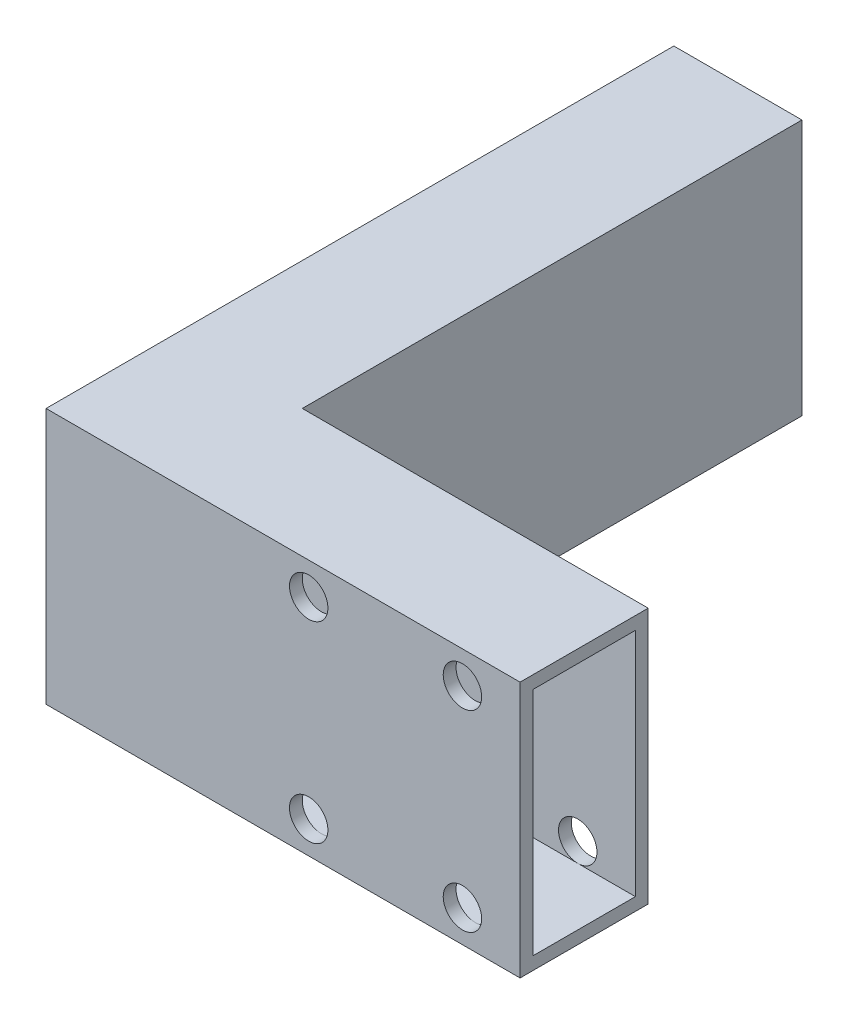
ISO-10303-21;
HEADER;
FILE_DESCRIPTION(('STEP AP214'),'2;1');
FILE_NAME('part.step','',(''),(''),'','','');
FILE_SCHEMA(('AUTOMOTIVE_DESIGN { 1 0 10303 214 1 1 1 1 }'));
ENDSEC;
DATA;
#1=APPLICATION_CONTEXT('core data for automotive mechanical design processes');
#2=APPLICATION_PROTOCOL_DEFINITION('international standard','automotive_design',2000,#1);
#3=PRODUCT_CONTEXT('',#1,'mechanical');
#4=PRODUCT('Part','Part','',(#3));
#5=PRODUCT_RELATED_PRODUCT_CATEGORY('part','',(#4));
#6=PRODUCT_DEFINITION_FORMATION('','',#4);
#7=PRODUCT_DEFINITION_CONTEXT('part definition',#1,'design');
#8=PRODUCT_DEFINITION('design','',#6,#7);
#9=PRODUCT_DEFINITION_SHAPE('','',#8);
#10=(LENGTH_UNIT() NAMED_UNIT(*) SI_UNIT(.MILLI.,.METRE.));
#11=(NAMED_UNIT(*) PLANE_ANGLE_UNIT() SI_UNIT($,.RADIAN.));
#12=(NAMED_UNIT(*) SI_UNIT($,.STERADIAN.) SOLID_ANGLE_UNIT());
#13=UNCERTAINTY_MEASURE_WITH_UNIT(LENGTH_MEASURE(1.E-05),#10,'distance_accuracy_value','');
#14=(GEOMETRIC_REPRESENTATION_CONTEXT(3) GLOBAL_UNCERTAINTY_ASSIGNED_CONTEXT((#13)) GLOBAL_UNIT_ASSIGNED_CONTEXT((#10,
#11,#12)) REPRESENTATION_CONTEXT('',''));
#15=CARTESIAN_POINT('',(0.,0.,0.));
#16=DIRECTION('',(0.,0.,1.));
#17=DIRECTION('',(1.,0.,0.));
#18=AXIS2_PLACEMENT_3D('',#15,#16,#17);
#19=CARTESIAN_POINT('',(20.5,17.5,-10.));
#20=DIRECTION('',(0.,0.,-1.));
#21=DIRECTION('',(-1.,0.,0.));
#22=AXIS2_PLACEMENT_3D('',#19,#20,#21);
#23=CYLINDRICAL_SURFACE('',#22,1.5);
#24=CARTESIAN_POINT('',(20.5,17.5,-0.999999999999999));
#25=DIRECTION('',(0.,0.,1.));
#26=DIRECTION('',(1.,0.,0.));
#27=AXIS2_PLACEMENT_3D('',#24,#25,#26);
#28=CIRCLE('',#27,1.5);
#29=CARTESIAN_POINT('',(20.5,19.,-0.999999999999999));
#30=VERTEX_POINT('',#29);
#31=EDGE_CURVE('E237',#30,#30,#28,.F.);
#32=ORIENTED_EDGE('',*,*,#31,.T.);
#33=EDGE_LOOP('',(#32));
#34=FACE_BOUND('',#33,.T.);
#35=CARTESIAN_POINT('',(20.5,17.5,0.));
#36=DIRECTION('',(0.,0.,-1.));
#37=DIRECTION('',(-1.,0.,0.));
#38=AXIS2_PLACEMENT_3D('',#35,#36,#37);
#39=CIRCLE('',#38,1.5);
#40=CARTESIAN_POINT('',(19.,17.5,0.));
#41=VERTEX_POINT('',#40);
#42=EDGE_CURVE('E271',#41,#41,#39,.T.);
#43=ORIENTED_EDGE('',*,*,#42,.F.);
#44=EDGE_LOOP('',(#43));
#45=FACE_BOUND('',#44,.T.);
#46=ADVANCED_FACE('F35',(#34,#45),#23,.F.);
#47=CARTESIAN_POINT('',(32.5,17.5,-10.));
#48=DIRECTION('',(0.,0.,-1.));
#49=DIRECTION('',(-1.,0.,0.));
#50=AXIS2_PLACEMENT_3D('',#47,#48,#49);
#51=CYLINDRICAL_SURFACE('',#50,1.5);
#52=CARTESIAN_POINT('',(32.5,17.5,-0.999999999999999));
#53=DIRECTION('',(0.,0.,1.));
#54=DIRECTION('',(1.,0.,0.));
#55=AXIS2_PLACEMENT_3D('',#52,#53,#54);
#56=CIRCLE('',#55,1.5);
#57=CARTESIAN_POINT('',(32.5,19.,-0.999999999999999));
#58=VERTEX_POINT('',#57);
#59=EDGE_CURVE('E234',#58,#58,#56,.F.);
#60=ORIENTED_EDGE('',*,*,#59,.T.);
#61=EDGE_LOOP('',(#60));
#62=FACE_BOUND('',#61,.T.);
#63=CARTESIAN_POINT('',(32.5,17.5,0.));
#64=DIRECTION('',(0.,0.,-1.));
#65=DIRECTION('',(-1.,0.,0.));
#66=AXIS2_PLACEMENT_3D('',#63,#64,#65);
#67=CIRCLE('',#66,1.5);
#68=CARTESIAN_POINT('',(31.,17.5,0.));
#69=VERTEX_POINT('',#68);
#70=EDGE_CURVE('E265',#69,#69,#67,.T.);
#71=ORIENTED_EDGE('',*,*,#70,.F.);
#72=EDGE_LOOP('',(#71));
#73=FACE_BOUND('',#72,.T.);
#74=ADVANCED_FACE('F340',(#62,#73),#51,.F.);
#75=CARTESIAN_POINT('',(32.5,2.5,-10.));
#76=DIRECTION('',(0.,0.,-1.));
#77=DIRECTION('',(-1.,0.,0.));
#78=AXIS2_PLACEMENT_3D('',#75,#76,#77);
#79=CYLINDRICAL_SURFACE('',#78,1.5);
#80=CARTESIAN_POINT('',(32.5,2.5,-0.999999999999999));
#81=DIRECTION('',(0.,0.,1.));
#82=DIRECTION('',(1.,0.,0.));
#83=AXIS2_PLACEMENT_3D('',#80,#81,#82);
#84=CIRCLE('',#83,1.5);
#85=CARTESIAN_POINT('',(32.5,0.999999999999999,-0.999999999999999));
#86=VERTEX_POINT('',#85);
#87=EDGE_CURVE('E231',#86,#86,#84,.F.);
#88=ORIENTED_EDGE('',*,*,#87,.T.);
#89=EDGE_LOOP('',(#88));
#90=FACE_BOUND('',#89,.T.);
#91=CARTESIAN_POINT('',(32.5,2.5,0.));
#92=DIRECTION('',(0.,0.,-1.));
#93=DIRECTION('',(-1.,0.,0.));
#94=AXIS2_PLACEMENT_3D('',#91,#92,#93);
#95=CIRCLE('',#94,1.5);
#96=CARTESIAN_POINT('',(31.,2.5,0.));
#97=VERTEX_POINT('',#96);
#98=EDGE_CURVE('E259',#97,#97,#95,.T.);
#99=ORIENTED_EDGE('',*,*,#98,.F.);
#100=EDGE_LOOP('',(#99));
#101=FACE_BOUND('',#100,.T.);
#102=ADVANCED_FACE('F347',(#90,#101),#79,.F.);
#103=CARTESIAN_POINT('',(20.5,2.5,-10.));
#104=DIRECTION('',(0.,0.,-1.));
#105=DIRECTION('',(-1.,0.,0.));
#106=AXIS2_PLACEMENT_3D('',#103,#104,#105);
#107=CYLINDRICAL_SURFACE('',#106,1.5);
#108=CARTESIAN_POINT('',(20.5,2.5,-0.999999999999999));
#109=DIRECTION('',(0.,0.,1.));
#110=DIRECTION('',(1.,0.,0.));
#111=AXIS2_PLACEMENT_3D('',#108,#109,#110);
#112=CIRCLE('',#111,1.5);
#113=CARTESIAN_POINT('',(20.5,1.,-0.999999999999999));
#114=VERTEX_POINT('',#113);
#115=EDGE_CURVE('E228',#114,#114,#112,.F.);
#116=ORIENTED_EDGE('',*,*,#115,.T.);
#117=EDGE_LOOP('',(#116));
#118=FACE_BOUND('',#117,.T.);
#119=CARTESIAN_POINT('',(20.5,2.5,0.));
#120=DIRECTION('',(0.,0.,-1.));
#121=DIRECTION('',(-1.,0.,0.));
#122=AXIS2_PLACEMENT_3D('',#119,#120,#121);
#123=CIRCLE('',#122,1.5);
#124=CARTESIAN_POINT('',(19.,2.5,0.));
#125=VERTEX_POINT('',#124);
#126=EDGE_CURVE('E253',#125,#125,#123,.T.);
#127=ORIENTED_EDGE('',*,*,#126,.F.);
#128=EDGE_LOOP('',(#127));
#129=FACE_BOUND('',#128,.T.);
#130=ADVANCED_FACE('F388',(#118,#129),#107,.F.);
#131=CARTESIAN_POINT('',(37.,20.,0.));
#132=DIRECTION('',(0.,0.,-1.));
#133=DIRECTION('',(-1.,0.,0.));
#134=AXIS2_PLACEMENT_3D('',#131,#132,#133);
#135=PLANE('',#134);
#136=ORIENTED_EDGE('',*,*,#126,.T.);
#137=EDGE_LOOP('',(#136));
#138=FACE_BOUND('',#137,.T.);
#139=ORIENTED_EDGE('',*,*,#98,.T.);
#140=EDGE_LOOP('',(#139));
#141=FACE_BOUND('',#140,.T.);
#142=ORIENTED_EDGE('',*,*,#70,.T.);
#143=EDGE_LOOP('',(#142));
#144=FACE_BOUND('',#143,.T.);
#145=ORIENTED_EDGE('',*,*,#42,.T.);
#146=EDGE_LOOP('',(#145));
#147=FACE_BOUND('',#146,.T.);
#148=DIRECTION('',(1.,0.,0.));
#149=VECTOR('',#148,1.);
#150=CARTESIAN_POINT('',(37.,0.,0.));
#151=LINE('',#150,#149);
#152=CARTESIAN_POINT('',(0.,0.,0.));
#153=VERTEX_POINT('',#152);
#154=CARTESIAN_POINT('',(37.,0.,0.));
#155=VERTEX_POINT('',#154);
#156=EDGE_CURVE('E274',#153,#155,#151,.T.);
#157=ORIENTED_EDGE('',*,*,#156,.T.);
#158=DIRECTION('',(0.,-1.,0.));
#159=VECTOR('',#158,1.);
#160=CARTESIAN_POINT('',(37.,20.,0.));
#161=LINE('',#160,#159);
#162=CARTESIAN_POINT('',(37.,20.,0.));
#163=VERTEX_POINT('',#162);
#164=EDGE_CURVE('E11',#163,#155,#161,.T.);
#165=ORIENTED_EDGE('',*,*,#164,.F.);
#166=DIRECTION('',(1.,0.,0.));
#167=VECTOR('',#166,1.);
#168=CARTESIAN_POINT('',(37.,20.,0.));
#169=LINE('',#168,#167);
#170=CARTESIAN_POINT('',(0.,20.,0.));
#171=VERTEX_POINT('',#170);
#172=EDGE_CURVE('E275',#171,#163,#169,.T.);
#173=ORIENTED_EDGE('',*,*,#172,.F.);
#174=DIRECTION('',(0.,-1.,0.));
#175=VECTOR('',#174,1.);
#176=CARTESIAN_POINT('',(0.,20.,0.));
#177=LINE('',#176,#175);
#178=EDGE_CURVE('E287',#171,#153,#177,.T.);
#179=ORIENTED_EDGE('',*,*,#178,.T.);
#180=EDGE_LOOP('',(#157,#165,#173,#179));
#181=FACE_BOUND('',#180,.T.);
#182=ADVANCED_FACE('F37',(#138,#141,#144,#147,#181),#135,.F.);
#183=CARTESIAN_POINT('',(37.,20.,-10.));
#184=DIRECTION('',(-1.,0.,0.));
#185=DIRECTION('',(0.,0.,1.));
#186=AXIS2_PLACEMENT_3D('',#183,#184,#185);
#187=PLANE('',#186);
#188=DIRECTION('',(0.,1.,0.));
#189=VECTOR('',#188,1.);
#190=CARTESIAN_POINT('',(37.,1.,-9.));
#191=LINE('',#190,#189);
#192=CARTESIAN_POINT('',(37.,1.,-9.));
#193=VERTEX_POINT('',#192);
#194=CARTESIAN_POINT('',(37.,19.,-9.));
#195=VERTEX_POINT('',#194);
#196=EDGE_CURVE('E190',#193,#195,#191,.T.);
#197=ORIENTED_EDGE('',*,*,#196,.F.);
#198=DIRECTION('',(0.,0.,-1.));
#199=VECTOR('',#198,1.);
#200=CARTESIAN_POINT('',(37.,1.,-0.999999999999999));
#201=LINE('',#200,#199);
#202=CARTESIAN_POINT('',(37.,1.,-0.999999999999999));
#203=VERTEX_POINT('',#202);
#204=EDGE_CURVE('E50',#203,#193,#201,.T.);
#205=ORIENTED_EDGE('',*,*,#204,.F.);
#206=DIRECTION('',(0.,-1.,0.));
#207=VECTOR('',#206,1.);
#208=CARTESIAN_POINT('',(37.,19.,-0.999999999999999));
#209=LINE('',#208,#207);
#210=CARTESIAN_POINT('',(37.,19.,-0.999999999999999));
#211=VERTEX_POINT('',#210);
#212=EDGE_CURVE('E196',#211,#203,#209,.T.);
#213=ORIENTED_EDGE('',*,*,#212,.F.);
#214=DIRECTION('',(0.,0.,1.));
#215=VECTOR('',#214,1.);
#216=CARTESIAN_POINT('',(37.,19.,-9.));
#217=LINE('',#216,#215);
#218=EDGE_CURVE('E193',#195,#211,#217,.T.);
#219=ORIENTED_EDGE('',*,*,#218,.F.);
#220=EDGE_LOOP('',(#197,#205,#213,#219));
#221=FACE_BOUND('',#220,.T.);
#222=DIRECTION('',(0.,0.,-1.));
#223=VECTOR('',#222,1.);
#224=CARTESIAN_POINT('',(37.,0.,-10.));
#225=LINE('',#224,#223);
#226=CARTESIAN_POINT('',(37.,0.,-10.));
#227=VERTEX_POINT('',#226);
#228=EDGE_CURVE('E290',#155,#227,#225,.T.);
#229=ORIENTED_EDGE('',*,*,#228,.T.);
#230=DIRECTION('',(0.,-1.,0.));
#231=VECTOR('',#230,1.);
#232=CARTESIAN_POINT('',(37.,20.,-10.));
#233=LINE('',#232,#231);
#234=CARTESIAN_POINT('',(37.,20.,-10.));
#235=VERTEX_POINT('',#234);
#236=EDGE_CURVE('E43',#235,#227,#233,.T.);
#237=ORIENTED_EDGE('',*,*,#236,.F.);
#238=DIRECTION('',(0.,0.,-1.));
#239=VECTOR('',#238,1.);
#240=CARTESIAN_POINT('',(37.,20.,-10.));
#241=LINE('',#240,#239);
#242=EDGE_CURVE('E278',#163,#235,#241,.T.);
#243=ORIENTED_EDGE('',*,*,#242,.F.);
#244=ORIENTED_EDGE('',*,*,#164,.T.);
#245=EDGE_LOOP('',(#229,#237,#243,#244));
#246=FACE_BOUND('',#245,.T.);
#247=ADVANCED_FACE('F326',(#221,#246),#187,.F.);
#248=CARTESIAN_POINT('',(10.,20.,-10.));
#249=DIRECTION('',(0.,0.,1.));
#250=DIRECTION('',(1.,0.,0.));
#251=AXIS2_PLACEMENT_3D('',#248,#249,#250);
#252=PLANE('',#251);
#253=CARTESIAN_POINT('',(20.5,2.5,-10.));
#254=DIRECTION('',(0.,0.,-1.));
#255=DIRECTION('',(-1.,0.,0.));
#256=AXIS2_PLACEMENT_3D('',#253,#254,#255);
#257=CIRCLE('',#256,1.5);
#258=CARTESIAN_POINT('',(19.,2.5,-10.));
#259=VERTEX_POINT('',#258);
#260=EDGE_CURVE('E247',#259,#259,#257,.T.);
#261=ORIENTED_EDGE('',*,*,#260,.F.);
#262=EDGE_LOOP('',(#261));
#263=FACE_BOUND('',#262,.T.);
#264=CARTESIAN_POINT('',(32.5,2.5,-10.));
#265=DIRECTION('',(0.,0.,-1.));
#266=DIRECTION('',(-1.,0.,0.));
#267=AXIS2_PLACEMENT_3D('',#264,#265,#266);
#268=CIRCLE('',#267,1.5);
#269=CARTESIAN_POINT('',(31.,2.5,-10.));
#270=VERTEX_POINT('',#269);
#271=EDGE_CURVE('E256',#270,#270,#268,.T.);
#272=ORIENTED_EDGE('',*,*,#271,.F.);
#273=EDGE_LOOP('',(#272));
#274=FACE_BOUND('',#273,.T.);
#275=CARTESIAN_POINT('',(32.5,17.5,-10.));
#276=DIRECTION('',(0.,0.,-1.));
#277=DIRECTION('',(-1.,0.,0.));
#278=AXIS2_PLACEMENT_3D('',#275,#276,#277);
#279=CIRCLE('',#278,1.5);
#280=CARTESIAN_POINT('',(31.,17.5,-10.));
#281=VERTEX_POINT('',#280);
#282=EDGE_CURVE('E262',#281,#281,#279,.T.);
#283=ORIENTED_EDGE('',*,*,#282,.F.);
#284=EDGE_LOOP('',(#283));
#285=FACE_BOUND('',#284,.T.);
#286=CARTESIAN_POINT('',(20.5,17.5,-10.));
#287=DIRECTION('',(0.,0.,-1.));
#288=DIRECTION('',(-1.,0.,0.));
#289=AXIS2_PLACEMENT_3D('',#286,#287,#288);
#290=CIRCLE('',#289,1.5);
#291=CARTESIAN_POINT('',(19.,17.5,-10.));
#292=VERTEX_POINT('',#291);
#293=EDGE_CURVE('E268',#292,#292,#290,.T.);
#294=ORIENTED_EDGE('',*,*,#293,.F.);
#295=EDGE_LOOP('',(#294));
#296=FACE_BOUND('',#295,.T.);
#297=DIRECTION('',(-1.,0.,0.));
#298=VECTOR('',#297,1.);
#299=CARTESIAN_POINT('',(10.,0.,-10.));
#300=LINE('',#299,#298);
#301=CARTESIAN_POINT('',(10.,0.,-10.));
#302=VERTEX_POINT('',#301);
#303=EDGE_CURVE('E292',#227,#302,#300,.T.);
#304=ORIENTED_EDGE('',*,*,#303,.T.);
#305=DIRECTION('',(0.,-1.,0.));
#306=VECTOR('',#305,1.);
#307=CARTESIAN_POINT('',(10.,20.,-10.));
#308=LINE('',#307,#306);
#309=CARTESIAN_POINT('',(10.,20.,-10.));
#310=VERTEX_POINT('',#309);
#311=EDGE_CURVE('E299',#310,#302,#308,.T.);
#312=ORIENTED_EDGE('',*,*,#311,.F.);
#313=DIRECTION('',(-1.,0.,0.));
#314=VECTOR('',#313,1.);
#315=CARTESIAN_POINT('',(10.,20.,-10.));
#316=LINE('',#315,#314);
#317=EDGE_CURVE('E281',#235,#310,#316,.T.);
#318=ORIENTED_EDGE('',*,*,#317,.F.);
#319=ORIENTED_EDGE('',*,*,#236,.T.);
#320=EDGE_LOOP('',(#304,#312,#318,#319));
#321=FACE_BOUND('',#320,.T.);
#322=ADVANCED_FACE('F306',(#263,#274,#285,#296,#321),#252,.F.);
#323=CARTESIAN_POINT('',(10.,20.,-35.));
#324=DIRECTION('',(-1.,0.,0.));
#325=DIRECTION('',(0.,0.,1.));
#326=AXIS2_PLACEMENT_3D('',#323,#324,#325);
#327=PLANE('',#326);
#328=DIRECTION('',(0.,0.,-1.));
#329=VECTOR('',#328,1.);
#330=CARTESIAN_POINT('',(10.,0.,-35.));
#331=LINE('',#330,#329);
#332=CARTESIAN_POINT('',(10.,0.,-49.));
#333=VERTEX_POINT('',#332);
#334=EDGE_CURVE('E294',#302,#333,#331,.T.);
#335=ORIENTED_EDGE('',*,*,#334,.T.);
#336=DIRECTION('',(0.,-1.,0.));
#337=VECTOR('',#336,1.);
#338=CARTESIAN_POINT('',(10.,0.,-49.));
#339=LINE('',#338,#337);
#340=CARTESIAN_POINT('',(10.,20.,-49.));
#341=VERTEX_POINT('',#340);
#342=EDGE_CURVE('E183',#341,#333,#339,.T.);
#343=ORIENTED_EDGE('',*,*,#342,.F.);
#344=DIRECTION('',(0.,0.,-1.));
#345=VECTOR('',#344,1.);
#346=CARTESIAN_POINT('',(10.,20.,-35.));
#347=LINE('',#346,#345);
#348=EDGE_CURVE('E283',#310,#341,#347,.T.);
#349=ORIENTED_EDGE('',*,*,#348,.F.);
#350=ORIENTED_EDGE('',*,*,#311,.T.);
#351=EDGE_LOOP('',(#335,#343,#349,#350));
#352=FACE_BOUND('',#351,.T.);
#353=ADVANCED_FACE('F316',(#352),#327,.F.);
#354=CARTESIAN_POINT('',(0.,20.,0.));
#355=DIRECTION('',(1.,0.,0.));
#356=DIRECTION('',(0.,0.,-1.));
#357=AXIS2_PLACEMENT_3D('',#354,#355,#356);
#358=PLANE('',#357);
#359=DIRECTION('',(0.,0.,1.));
#360=VECTOR('',#359,1.);
#361=CARTESIAN_POINT('',(0.,0.,0.));
#362=LINE('',#361,#360);
#363=CARTESIAN_POINT('',(0.,0.,-49.));
#364=VERTEX_POINT('',#363);
#365=EDGE_CURVE('E279',#364,#153,#362,.T.);
#366=ORIENTED_EDGE('',*,*,#365,.T.);
#367=ORIENTED_EDGE('',*,*,#178,.F.);
#368=DIRECTION('',(0.,0.,1.));
#369=VECTOR('',#368,1.);
#370=CARTESIAN_POINT('',(0.,20.,0.));
#371=LINE('',#370,#369);
#372=CARTESIAN_POINT('',(0.,20.,-49.));
#373=VERTEX_POINT('',#372);
#374=EDGE_CURVE('E285',#373,#171,#371,.T.);
#375=ORIENTED_EDGE('',*,*,#374,.F.);
#376=DIRECTION('',(0.,1.,0.));
#377=VECTOR('',#376,1.);
#378=CARTESIAN_POINT('',(0.,20.,-49.));
#379=LINE('',#378,#377);
#380=EDGE_CURVE('E177',#364,#373,#379,.T.);
#381=ORIENTED_EDGE('',*,*,#380,.F.);
#382=EDGE_LOOP('',(#366,#367,#375,#381));
#383=FACE_BOUND('',#382,.T.);
#384=ADVANCED_FACE('F329',(#383),#358,.F.);
#385=CARTESIAN_POINT('',(0.,20.,0.));
#386=DIRECTION('',(0.,-1.,0.));
#387=DIRECTION('',(0.,0.,-1.));
#388=AXIS2_PLACEMENT_3D('',#385,#386,#387);
#389=PLANE('',#388);
#390=ORIENTED_EDGE('',*,*,#172,.T.);
#391=ORIENTED_EDGE('',*,*,#242,.T.);
#392=ORIENTED_EDGE('',*,*,#317,.T.);
#393=ORIENTED_EDGE('',*,*,#348,.T.);
#394=DIRECTION('',(1.,0.,0.));
#395=VECTOR('',#394,1.);
#396=CARTESIAN_POINT('',(10.,20.,-49.));
#397=LINE('',#396,#395);
#398=EDGE_CURVE('E180',#373,#341,#397,.T.);
#399=ORIENTED_EDGE('',*,*,#398,.F.);
#400=ORIENTED_EDGE('',*,*,#374,.T.);
#401=EDGE_LOOP('',(#390,#391,#392,#393,#399,#400));
#402=FACE_BOUND('',#401,.T.);
#403=ADVANCED_FACE('F322',(#402),#389,.F.);
#404=CARTESIAN_POINT('',(0.,0.,0.));
#405=DIRECTION('',(0.,-1.,0.));
#406=DIRECTION('',(0.,0.,-1.));
#407=AXIS2_PLACEMENT_3D('',#404,#405,#406);
#408=PLANE('',#407);
#409=ORIENTED_EDGE('',*,*,#156,.F.);
#410=ORIENTED_EDGE('',*,*,#365,.F.);
#411=DIRECTION('',(-1.,0.,0.));
#412=VECTOR('',#411,1.);
#413=CARTESIAN_POINT('',(0.,0.,-49.));
#414=LINE('',#413,#412);
#415=EDGE_CURVE('E186',#333,#364,#414,.T.);
#416=ORIENTED_EDGE('',*,*,#415,.F.);
#417=ORIENTED_EDGE('',*,*,#334,.F.);
#418=ORIENTED_EDGE('',*,*,#303,.F.);
#419=ORIENTED_EDGE('',*,*,#228,.F.);
#420=EDGE_LOOP('',(#409,#410,#416,#417,#418,#419));
#421=FACE_BOUND('',#420,.T.);
#422=ADVANCED_FACE('F312',(#421),#408,.T.);
#423=CARTESIAN_POINT('',(20.5,17.5,-9.));
#424=DIRECTION('',(0.,0.,-1.));
#425=DIRECTION('',(-1.,0.,0.));
#426=AXIS2_PLACEMENT_3D('',#423,#424,#425);
#427=CIRCLE('',#426,1.5);
#428=CARTESIAN_POINT('',(20.5,19.,-9.));
#429=VERTEX_POINT('',#428);
#430=EDGE_CURVE('E225',#429,#429,#427,.F.);
#431=ORIENTED_EDGE('',*,*,#430,.T.);
#432=EDGE_LOOP('',(#431));
#433=FACE_BOUND('',#432,.T.);
#434=ORIENTED_EDGE('',*,*,#293,.T.);
#435=EDGE_LOOP('',(#434));
#436=FACE_BOUND('',#435,.T.);
#437=ADVANCED_FACE('F343',(#433,#436),#23,.F.);
#438=CARTESIAN_POINT('',(32.5,17.5,-9.));
#439=DIRECTION('',(0.,0.,-1.));
#440=DIRECTION('',(-1.,0.,0.));
#441=AXIS2_PLACEMENT_3D('',#438,#439,#440);
#442=CIRCLE('',#441,1.5);
#443=CARTESIAN_POINT('',(32.5,19.,-9.));
#444=VERTEX_POINT('',#443);
#445=EDGE_CURVE('E222',#444,#444,#442,.F.);
#446=ORIENTED_EDGE('',*,*,#445,.T.);
#447=EDGE_LOOP('',(#446));
#448=FACE_BOUND('',#447,.T.);
#449=ORIENTED_EDGE('',*,*,#282,.T.);
#450=EDGE_LOOP('',(#449));
#451=FACE_BOUND('',#450,.T.);
#452=ADVANCED_FACE('F350',(#448,#451),#51,.F.);
#453=CARTESIAN_POINT('',(32.5,2.5,-9.));
#454=DIRECTION('',(0.,0.,-1.));
#455=DIRECTION('',(-1.,0.,0.));
#456=AXIS2_PLACEMENT_3D('',#453,#454,#455);
#457=CIRCLE('',#456,1.5);
#458=CARTESIAN_POINT('',(32.5,1.,-9.));
#459=VERTEX_POINT('',#458);
#460=EDGE_CURVE('E219',#459,#459,#457,.F.);
#461=ORIENTED_EDGE('',*,*,#460,.T.);
#462=EDGE_LOOP('',(#461));
#463=FACE_BOUND('',#462,.T.);
#464=ORIENTED_EDGE('',*,*,#271,.T.);
#465=EDGE_LOOP('',(#464));
#466=FACE_BOUND('',#465,.T.);
#467=ADVANCED_FACE('F358',(#463,#466),#79,.F.);
#468=CARTESIAN_POINT('',(20.5,2.5,-9.));
#469=DIRECTION('',(0.,0.,-1.));
#470=DIRECTION('',(-1.,0.,0.));
#471=AXIS2_PLACEMENT_3D('',#468,#469,#470);
#472=CIRCLE('',#471,1.5);
#473=CARTESIAN_POINT('',(20.5,1.,-9.));
#474=VERTEX_POINT('',#473);
#475=EDGE_CURVE('E216',#474,#474,#472,.F.);
#476=ORIENTED_EDGE('',*,*,#475,.T.);
#477=EDGE_LOOP('',(#476));
#478=FACE_BOUND('',#477,.T.);
#479=ORIENTED_EDGE('',*,*,#260,.T.);
#480=EDGE_LOOP('',(#479));
#481=FACE_BOUND('',#480,.T.);
#482=ADVANCED_FACE('F379',(#478,#481),#107,.F.);
#483=CARTESIAN_POINT('',(9.,19.,-1.));
#484=DIRECTION('',(1.,0.,0.));
#485=DIRECTION('',(0.,0.,-1.));
#486=AXIS2_PLACEMENT_3D('',#483,#484,#485);
#487=PLANE('',#486);
#488=DIRECTION('',(0.,0.,-1.));
#489=VECTOR('',#488,1.);
#490=CARTESIAN_POINT('',(9.,1.,-1.));
#491=LINE('',#490,#489);
#492=CARTESIAN_POINT('',(9.,1.,-9.));
#493=VERTEX_POINT('',#492);
#494=CARTESIAN_POINT('',(9.,1.,-49.));
#495=VERTEX_POINT('',#494);
#496=EDGE_CURVE('E246',#493,#495,#491,.T.);
#497=ORIENTED_EDGE('',*,*,#496,.F.);
#498=DIRECTION('',(0.,1.,0.));
#499=VECTOR('',#498,1.);
#500=CARTESIAN_POINT('',(9.,19.,-9.));
#501=LINE('',#500,#499);
#502=CARTESIAN_POINT('',(9.,19.,-9.));
#503=VERTEX_POINT('',#502);
#504=EDGE_CURVE('E213',#493,#503,#501,.T.);
#505=ORIENTED_EDGE('',*,*,#504,.T.);
#506=DIRECTION('',(0.,0.,-1.));
#507=VECTOR('',#506,1.);
#508=CARTESIAN_POINT('',(9.,19.,-1.));
#509=LINE('',#508,#507);
#510=CARTESIAN_POINT('',(9.,19.,-49.));
#511=VERTEX_POINT('',#510);
#512=EDGE_CURVE('E159',#503,#511,#509,.T.);
#513=ORIENTED_EDGE('',*,*,#512,.T.);
#514=DIRECTION('',(0.,-1.,0.));
#515=VECTOR('',#514,1.);
#516=CARTESIAN_POINT('',(9.,19.,-49.));
#517=LINE('',#516,#515);
#518=EDGE_CURVE('E171',#511,#495,#517,.T.);
#519=ORIENTED_EDGE('',*,*,#518,.T.);
#520=EDGE_LOOP('',(#497,#505,#513,#519));
#521=FACE_BOUND('',#520,.T.);
#522=ADVANCED_FACE('F385',(#521),#487,.F.);
#523=CARTESIAN_POINT('',(1.,19.,-1.));
#524=DIRECTION('',(0.,1.,0.));
#525=DIRECTION('',(0.,0.,1.));
#526=AXIS2_PLACEMENT_3D('',#523,#524,#525);
#527=PLANE('',#526);
#528=ORIENTED_EDGE('',*,*,#512,.F.);
#529=DIRECTION('',(1.,0.,0.));
#530=VECTOR('',#529,1.);
#531=CARTESIAN_POINT('',(1.,19.,-9.));
#532=LINE('',#531,#530);
#533=EDGE_CURVE('E206',#503,#429,#532,.T.);
#534=ORIENTED_EDGE('',*,*,#533,.T.);
#535=EDGE_CURVE('E209',#429,#444,#532,.T.);
#536=ORIENTED_EDGE('',*,*,#535,.T.);
#537=EDGE_CURVE('E207',#444,#195,#532,.T.);
#538=ORIENTED_EDGE('',*,*,#537,.T.);
#539=ORIENTED_EDGE('',*,*,#218,.T.);
#540=DIRECTION('',(1.,0.,0.));
#541=VECTOR('',#540,1.);
#542=CARTESIAN_POINT('',(1.,19.,-0.999999999999999));
#543=LINE('',#542,#541);
#544=EDGE_CURVE('E204',#58,#211,#543,.T.);
#545=ORIENTED_EDGE('',*,*,#544,.F.);
#546=EDGE_CURVE('E203',#30,#58,#543,.T.);
#547=ORIENTED_EDGE('',*,*,#546,.F.);
#548=DIRECTION('',(1.,0.,0.));
#549=VECTOR('',#548,1.);
#550=CARTESIAN_POINT('',(1.,19.,-1.));
#551=LINE('',#550,#549);
#552=CARTESIAN_POINT('',(1.,19.,-1.));
#553=VERTEX_POINT('',#552);
#554=EDGE_CURVE('E58',#553,#30,#551,.T.);
#555=ORIENTED_EDGE('',*,*,#554,.F.);
#556=DIRECTION('',(0.,0.,-1.));
#557=VECTOR('',#556,1.);
#558=CARTESIAN_POINT('',(1.,19.,-1.));
#559=LINE('',#558,#557);
#560=CARTESIAN_POINT('',(1.,19.,-49.));
#561=VERTEX_POINT('',#560);
#562=EDGE_CURVE('E150',#553,#561,#559,.T.);
#563=ORIENTED_EDGE('',*,*,#562,.T.);
#564=DIRECTION('',(1.,0.,0.));
#565=VECTOR('',#564,1.);
#566=CARTESIAN_POINT('',(1.,19.,-49.));
#567=LINE('',#566,#565);
#568=EDGE_CURVE('E155',#561,#511,#567,.T.);
#569=ORIENTED_EDGE('',*,*,#568,.T.);
#570=EDGE_LOOP('',(#528,#534,#536,#538,#539,#545,#547,#555,#563,#569));
#571=FACE_BOUND('',#570,.T.);
#572=ADVANCED_FACE('F153',(#571),#527,.F.);
#573=CARTESIAN_POINT('',(1.,1.,-1.));
#574=DIRECTION('',(-1.,0.,0.));
#575=DIRECTION('',(0.,0.,1.));
#576=AXIS2_PLACEMENT_3D('',#573,#574,#575);
#577=PLANE('',#576);
#578=DIRECTION('',(0.,0.,-1.));
#579=VECTOR('',#578,1.);
#580=CARTESIAN_POINT('',(1.,1.,-1.));
#581=LINE('',#580,#579);
#582=CARTESIAN_POINT('',(1.,1.,-1.));
#583=VERTEX_POINT('',#582);
#584=CARTESIAN_POINT('',(1.,1.,-49.));
#585=VERTEX_POINT('',#584);
#586=EDGE_CURVE('E160',#583,#585,#581,.T.);
#587=ORIENTED_EDGE('',*,*,#586,.T.);
#588=DIRECTION('',(0.,1.,0.));
#589=VECTOR('',#588,1.);
#590=CARTESIAN_POINT('',(1.,1.,-49.));
#591=LINE('',#590,#589);
#592=EDGE_CURVE('E163',#585,#561,#591,.T.);
#593=ORIENTED_EDGE('',*,*,#592,.T.);
#594=ORIENTED_EDGE('',*,*,#562,.F.);
#595=DIRECTION('',(0.,1.,0.));
#596=VECTOR('',#595,1.);
#597=CARTESIAN_POINT('',(1.,1.,-1.));
#598=LINE('',#597,#596);
#599=EDGE_CURVE('E243',#583,#553,#598,.T.);
#600=ORIENTED_EDGE('',*,*,#599,.F.);
#601=EDGE_LOOP('',(#587,#593,#594,#600));
#602=FACE_BOUND('',#601,.T.);
#603=ADVANCED_FACE('F164',(#602),#577,.F.);
#604=CARTESIAN_POINT('',(9.,1.,-1.));
#605=DIRECTION('',(0.,-1.,0.));
#606=DIRECTION('',(0.,0.,-1.));
#607=AXIS2_PLACEMENT_3D('',#604,#605,#606);
#608=PLANE('',#607);
#609=ORIENTED_EDGE('',*,*,#496,.T.);
#610=DIRECTION('',(-1.,0.,0.));
#611=VECTOR('',#610,1.);
#612=CARTESIAN_POINT('',(9.,1.,-49.));
#613=LINE('',#612,#611);
#614=EDGE_CURVE('E173',#495,#585,#613,.T.);
#615=ORIENTED_EDGE('',*,*,#614,.T.);
#616=ORIENTED_EDGE('',*,*,#586,.F.);
#617=DIRECTION('',(-1.,0.,0.));
#618=VECTOR('',#617,1.);
#619=CARTESIAN_POINT('',(9.,1.,-1.));
#620=LINE('',#619,#618);
#621=EDGE_CURVE('E240',#114,#583,#620,.T.);
#622=ORIENTED_EDGE('',*,*,#621,.F.);
#623=DIRECTION('',(1.,0.,0.));
#624=VECTOR('',#623,1.);
#625=CARTESIAN_POINT('',(1.,1.,-0.999999999999999));
#626=LINE('',#625,#624);
#627=EDGE_CURVE('E202',#114,#86,#626,.T.);
#628=ORIENTED_EDGE('',*,*,#627,.T.);
#629=EDGE_CURVE('E200',#86,#203,#626,.T.);
#630=ORIENTED_EDGE('',*,*,#629,.T.);
#631=ORIENTED_EDGE('',*,*,#204,.T.);
#632=DIRECTION('',(1.,0.,0.));
#633=VECTOR('',#632,1.);
#634=CARTESIAN_POINT('',(1.,1.,-9.));
#635=LINE('',#634,#633);
#636=EDGE_CURVE('E199',#459,#193,#635,.T.);
#637=ORIENTED_EDGE('',*,*,#636,.F.);
#638=EDGE_CURVE('E212',#474,#459,#635,.T.);
#639=ORIENTED_EDGE('',*,*,#638,.F.);
#640=EDGE_CURVE('E210',#493,#474,#635,.T.);
#641=ORIENTED_EDGE('',*,*,#640,.F.);
#642=EDGE_LOOP('',(#609,#615,#616,#622,#628,#630,#631,#637,#639,#641));
#643=FACE_BOUND('',#642,.T.);
#644=ADVANCED_FACE('F452',(#643),#608,.F.);
#645=CARTESIAN_POINT('',(0.,0.,-1.));
#646=DIRECTION('',(0.,0.,-1.));
#647=DIRECTION('',(-1.,0.,0.));
#648=AXIS2_PLACEMENT_3D('',#645,#646,#647);
#649=PLANE('',#648);
#650=ORIENTED_EDGE('',*,*,#554,.T.);
#651=ORIENTED_EDGE('',*,*,#31,.F.);
#652=ORIENTED_EDGE('',*,*,#546,.T.);
#653=ORIENTED_EDGE('',*,*,#59,.F.);
#654=ORIENTED_EDGE('',*,*,#544,.T.);
#655=ORIENTED_EDGE('',*,*,#212,.T.);
#656=ORIENTED_EDGE('',*,*,#629,.F.);
#657=ORIENTED_EDGE('',*,*,#87,.F.);
#658=ORIENTED_EDGE('',*,*,#627,.F.);
#659=ORIENTED_EDGE('',*,*,#115,.F.);
#660=ORIENTED_EDGE('',*,*,#621,.T.);
#661=ORIENTED_EDGE('',*,*,#599,.T.);
#662=EDGE_LOOP('',(#650,#651,#652,#653,#654,#655,#656,#657,#658,#659,#660,#661));
#663=FACE_BOUND('',#662,.T.);
#664=ADVANCED_FACE('F447',(#663),#649,.T.);
#665=CARTESIAN_POINT('',(1.,1.,-9.));
#666=DIRECTION('',(0.,0.,-1.));
#667=DIRECTION('',(-1.,0.,0.));
#668=AXIS2_PLACEMENT_3D('',#665,#666,#667);
#669=PLANE('',#668);
#670=ORIENTED_EDGE('',*,*,#533,.F.);
#671=ORIENTED_EDGE('',*,*,#504,.F.);
#672=ORIENTED_EDGE('',*,*,#640,.T.);
#673=ORIENTED_EDGE('',*,*,#475,.F.);
#674=ORIENTED_EDGE('',*,*,#638,.T.);
#675=ORIENTED_EDGE('',*,*,#460,.F.);
#676=ORIENTED_EDGE('',*,*,#636,.T.);
#677=ORIENTED_EDGE('',*,*,#196,.T.);
#678=ORIENTED_EDGE('',*,*,#537,.F.);
#679=ORIENTED_EDGE('',*,*,#445,.F.);
#680=ORIENTED_EDGE('',*,*,#535,.F.);
#681=ORIENTED_EDGE('',*,*,#430,.F.);
#682=EDGE_LOOP('',(#670,#671,#672,#673,#674,#675,#676,#677,#678,#679,#680,#681));
#683=FACE_BOUND('',#682,.T.);
#684=ADVANCED_FACE('F451',(#683),#669,.F.);
#685=CARTESIAN_POINT('',(0.,0.,-49.));
#686=DIRECTION('',(0.,0.,1.));
#687=DIRECTION('',(1.,0.,0.));
#688=AXIS2_PLACEMENT_3D('',#685,#686,#687);
#689=PLANE('',#688);
#690=ORIENTED_EDGE('',*,*,#380,.T.);
#691=ORIENTED_EDGE('',*,*,#398,.T.);
#692=ORIENTED_EDGE('',*,*,#342,.T.);
#693=ORIENTED_EDGE('',*,*,#415,.T.);
#694=EDGE_LOOP('',(#690,#691,#692,#693));
#695=FACE_BOUND('',#694,.T.);
#696=ORIENTED_EDGE('',*,*,#592,.F.);
#697=ORIENTED_EDGE('',*,*,#614,.F.);
#698=ORIENTED_EDGE('',*,*,#518,.F.);
#699=ORIENTED_EDGE('',*,*,#568,.F.);
#700=EDGE_LOOP('',(#696,#697,#698,#699));
#701=FACE_BOUND('',#700,.T.);
#702=ADVANCED_FACE('F169',(#695,#701),#689,.F.);
#703=CLOSED_SHELL('',(#46,#74,#102,#130,#182,#247,#322,#353,#384,#403,#422,#437,#452,#467,#482,
#522,#572,#603,#644,#664,#684,#702));
#704=MANIFOLD_SOLID_BREP('B2',#703);
#705=ADVANCED_BREP_SHAPE_REPRESENTATION('',(#18,#704),#14);
#706=SHAPE_DEFINITION_REPRESENTATION(#9,#705);
ENDSEC;
END-ISO-10303-21;
